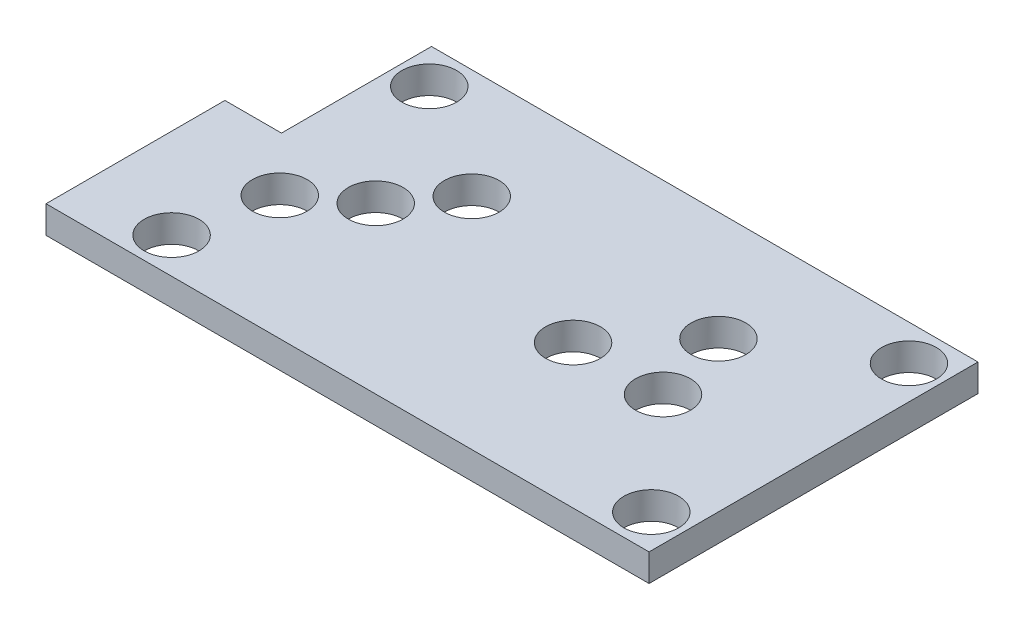
ISO-10303-21;
HEADER;
FILE_DESCRIPTION(('STEP AP214'),'2;1');
FILE_NAME('part.step','',(''),(''),'','','');
FILE_SCHEMA(('AUTOMOTIVE_DESIGN { 1 0 10303 214 1 1 1 1 }'));
ENDSEC;
DATA;
#1=APPLICATION_CONTEXT('core data for automotive mechanical design processes');
#2=APPLICATION_PROTOCOL_DEFINITION('international standard','automotive_design',2000,#1);
#3=PRODUCT_CONTEXT('',#1,'mechanical');
#4=PRODUCT('Part','Part','',(#3));
#5=PRODUCT_RELATED_PRODUCT_CATEGORY('part','',(#4));
#6=PRODUCT_DEFINITION_FORMATION('','',#4);
#7=PRODUCT_DEFINITION_CONTEXT('part definition',#1,'design');
#8=PRODUCT_DEFINITION('design','',#6,#7);
#9=PRODUCT_DEFINITION_SHAPE('','',#8);
#10=(LENGTH_UNIT() NAMED_UNIT(*) SI_UNIT(.MILLI.,.METRE.));
#11=(NAMED_UNIT(*) PLANE_ANGLE_UNIT() SI_UNIT($,.RADIAN.));
#12=(NAMED_UNIT(*) SI_UNIT($,.STERADIAN.) SOLID_ANGLE_UNIT());
#13=UNCERTAINTY_MEASURE_WITH_UNIT(LENGTH_MEASURE(1.E-05),#10,'distance_accuracy_value','');
#14=(GEOMETRIC_REPRESENTATION_CONTEXT(3) GLOBAL_UNCERTAINTY_ASSIGNED_CONTEXT((#13)) GLOBAL_UNIT_ASSIGNED_CONTEXT((#10,
#11,#12)) REPRESENTATION_CONTEXT('',''));
#15=CARTESIAN_POINT('',(0.,0.,0.));
#16=DIRECTION('',(0.,0.,1.));
#17=DIRECTION('',(1.,0.,0.));
#18=AXIS2_PLACEMENT_3D('',#15,#16,#17);
#19=CARTESIAN_POINT('',(110.,-10.,60.));
#20=DIRECTION('',(1.,0.,0.));
#21=DIRECTION('',(0.,0.,-1.));
#22=AXIS2_PLACEMENT_3D('',#19,#20,#21);
#23=PLANE('',#22);
#24=DIRECTION('',(0.,0.,-1.));
#25=VECTOR('',#24,1.);
#26=CARTESIAN_POINT('',(110.,0.,60.));
#27=LINE('',#26,#25);
#28=CARTESIAN_POINT('',(110.,0.,60.));
#29=VERTEX_POINT('',#28);
#30=CARTESIAN_POINT('',(110.,0.,-60.));
#31=VERTEX_POINT('',#30);
#32=EDGE_CURVE('E129',#29,#31,#27,.T.);
#33=ORIENTED_EDGE('',*,*,#32,.F.);
#34=DIRECTION('',(0.,1.,0.));
#35=VECTOR('',#34,1.);
#36=CARTESIAN_POINT('',(110.,-10.,60.));
#37=LINE('',#36,#35);
#38=CARTESIAN_POINT('',(110.,-10.,60.));
#39=VERTEX_POINT('',#38);
#40=EDGE_CURVE('E11',#39,#29,#37,.T.);
#41=ORIENTED_EDGE('',*,*,#40,.F.);
#42=DIRECTION('',(0.,0.,-1.));
#43=VECTOR('',#42,1.);
#44=CARTESIAN_POINT('',(110.,-10.,60.));
#45=LINE('',#44,#43);
#46=CARTESIAN_POINT('',(110.,-10.,-60.));
#47=VERTEX_POINT('',#46);
#48=EDGE_CURVE('E120',#39,#47,#45,.T.);
#49=ORIENTED_EDGE('',*,*,#48,.T.);
#50=DIRECTION('',(0.,1.,0.));
#51=VECTOR('',#50,1.);
#52=CARTESIAN_POINT('',(110.,-10.,-60.));
#53=LINE('',#52,#51);
#54=EDGE_CURVE('E42',#47,#31,#53,.T.);
#55=ORIENTED_EDGE('',*,*,#54,.T.);
#56=EDGE_LOOP('',(#33,#41,#49,#55));
#57=FACE_BOUND('',#56,.T.);
#58=ADVANCED_FACE('F39',(#57),#23,.T.);
#59=CARTESIAN_POINT('',(-110.,-10.,60.));
#60=DIRECTION('',(0.,0.,1.));
#61=DIRECTION('',(1.,0.,0.));
#62=AXIS2_PLACEMENT_3D('',#59,#60,#61);
#63=PLANE('',#62);
#64=DIRECTION('',(1.,0.,0.));
#65=VECTOR('',#64,1.);
#66=CARTESIAN_POINT('',(-110.,0.,60.));
#67=LINE('',#66,#65);
#68=CARTESIAN_POINT('',(-110.,0.,60.));
#69=VERTEX_POINT('',#68);
#70=EDGE_CURVE('E124',#69,#29,#67,.T.);
#71=ORIENTED_EDGE('',*,*,#70,.F.);
#72=DIRECTION('',(0.,1.,0.));
#73=VECTOR('',#72,1.);
#74=CARTESIAN_POINT('',(-110.,-10.,60.));
#75=LINE('',#74,#73);
#76=CARTESIAN_POINT('',(-110.,-10.,60.));
#77=VERTEX_POINT('',#76);
#78=EDGE_CURVE('E47',#77,#69,#75,.T.);
#79=ORIENTED_EDGE('',*,*,#78,.F.);
#80=DIRECTION('',(1.,0.,0.));
#81=VECTOR('',#80,1.);
#82=CARTESIAN_POINT('',(-110.,-10.,60.));
#83=LINE('',#82,#81);
#84=EDGE_CURVE('E122',#77,#39,#83,.T.);
#85=ORIENTED_EDGE('',*,*,#84,.T.);
#86=ORIENTED_EDGE('',*,*,#40,.T.);
#87=EDGE_LOOP('',(#71,#79,#85,#86));
#88=FACE_BOUND('',#87,.T.);
#89=ADVANCED_FACE('F143',(#88),#63,.T.);
#90=CARTESIAN_POINT('',(-110.,-10.,60.));
#91=DIRECTION('',(-1.,0.,0.));
#92=DIRECTION('',(0.,0.,1.));
#93=AXIS2_PLACEMENT_3D('',#90,#91,#92);
#94=PLANE('',#93);
#95=DIRECTION('',(0.,1.,0.));
#96=VECTOR('',#95,1.);
#97=CARTESIAN_POINT('',(-110.,-10.001,-5.2699959967968));
#98=LINE('',#97,#96);
#99=CARTESIAN_POINT('',(-110.,-10.,-5.2699959967968));
#100=VERTEX_POINT('',#99);
#101=CARTESIAN_POINT('',(-110.,0.,-5.2699959967968));
#102=VERTEX_POINT('',#101);
#103=EDGE_CURVE('E55',#100,#102,#98,.T.);
#104=ORIENTED_EDGE('',*,*,#103,.F.);
#105=DIRECTION('',(0.,0.,1.));
#106=VECTOR('',#105,1.);
#107=CARTESIAN_POINT('',(-110.,-10.,60.));
#108=LINE('',#107,#106);
#109=EDGE_CURVE('E119',#100,#77,#108,.T.);
#110=ORIENTED_EDGE('',*,*,#109,.T.);
#111=ORIENTED_EDGE('',*,*,#78,.T.);
#112=DIRECTION('',(0.,0.,1.));
#113=VECTOR('',#112,1.);
#114=CARTESIAN_POINT('',(-110.,0.,60.));
#115=LINE('',#114,#113);
#116=EDGE_CURVE('E134',#102,#69,#115,.T.);
#117=ORIENTED_EDGE('',*,*,#116,.F.);
#118=EDGE_LOOP('',(#104,#110,#111,#117));
#119=FACE_BOUND('',#118,.T.);
#120=ADVANCED_FACE('F145',(#119),#94,.T.);
#121=CARTESIAN_POINT('',(-110.,-10.,-60.));
#122=DIRECTION('',(0.,0.,-1.));
#123=DIRECTION('',(-1.,0.,0.));
#124=AXIS2_PLACEMENT_3D('',#121,#122,#123);
#125=PLANE('',#124);
#126=DIRECTION('',(0.,1.,0.));
#127=VECTOR('',#126,1.);
#128=CARTESIAN_POINT('',(-89.3674969975976,-10.001,-60.));
#129=LINE('',#128,#127);
#130=CARTESIAN_POINT('',(-89.3674969975976,-10.,-60.));
#131=VERTEX_POINT('',#130);
#132=CARTESIAN_POINT('',(-89.3674969975976,0.,-60.));
#133=VERTEX_POINT('',#132);
#134=EDGE_CURVE('E99',#131,#133,#129,.T.);
#135=ORIENTED_EDGE('',*,*,#134,.T.);
#136=DIRECTION('',(-1.,0.,0.));
#137=VECTOR('',#136,1.);
#138=CARTESIAN_POINT('',(-110.,0.,-60.));
#139=LINE('',#138,#137);
#140=EDGE_CURVE('E132',#31,#133,#139,.T.);
#141=ORIENTED_EDGE('',*,*,#140,.F.);
#142=ORIENTED_EDGE('',*,*,#54,.F.);
#143=DIRECTION('',(-1.,0.,0.));
#144=VECTOR('',#143,1.);
#145=CARTESIAN_POINT('',(-110.,-10.,-60.));
#146=LINE('',#145,#144);
#147=EDGE_CURVE('E113',#47,#131,#146,.T.);
#148=ORIENTED_EDGE('',*,*,#147,.T.);
#149=EDGE_LOOP('',(#135,#141,#142,#148));
#150=FACE_BOUND('',#149,.T.);
#151=ADVANCED_FACE('F118',(#150),#125,.T.);
#152=CARTESIAN_POINT('',(0.,-10.,0.));
#153=DIRECTION('',(0.,-1.,0.));
#154=DIRECTION('',(0.,0.,-1.));
#155=AXIS2_PLACEMENT_3D('',#152,#153,#154);
#156=PLANE('',#155);
#157=CARTESIAN_POINT('',(62.8162515012012,-10.,7.72));
#158=DIRECTION('',(0.,-1.,0.));
#159=DIRECTION('',(0.,0.,-1.));
#160=AXIS2_PLACEMENT_3D('',#157,#158,#159);
#161=CIRCLE('',#160,10.);
#162=CARTESIAN_POINT('',(62.8162515012012,-10.,-2.28000000000001));
#163=VERTEX_POINT('',#162);
#164=EDGE_CURVE('E173',#163,#163,#161,.F.);
#165=ORIENTED_EDGE('',*,*,#164,.T.);
#166=EDGE_LOOP('',(#165));
#167=FACE_BOUND('',#166,.T.);
#168=CARTESIAN_POINT('',(55.3162515012012,-10.,-20.));
#169=DIRECTION('',(0.,-1.,0.));
#170=DIRECTION('',(0.,0.,-1.));
#171=AXIS2_PLACEMENT_3D('',#168,#169,#170);
#172=CIRCLE('',#171,10.);
#173=CARTESIAN_POINT('',(55.3162515012012,-10.,-30.));
#174=VERTEX_POINT('',#173);
#175=EDGE_CURVE('E184',#174,#174,#172,.F.);
#176=ORIENTED_EDGE('',*,*,#175,.T.);
#177=EDGE_LOOP('',(#176));
#178=FACE_BOUND('',#177,.T.);
#179=CARTESIAN_POINT('',(97.8162515012012,-10.,-47.));
#180=DIRECTION('',(0.,-1.,0.));
#181=DIRECTION('',(0.,0.,-1.));
#182=AXIS2_PLACEMENT_3D('',#179,#180,#181);
#183=CIRCLE('',#182,10.);
#184=CARTESIAN_POINT('',(97.8162515012012,-10.,-57.));
#185=VERTEX_POINT('',#184);
#186=EDGE_CURVE('E185',#185,#185,#183,.F.);
#187=ORIENTED_EDGE('',*,*,#186,.T.);
#188=EDGE_LOOP('',(#187));
#189=FACE_BOUND('',#188,.T.);
#190=CARTESIAN_POINT('',(-34.6837484987988,-10.,-20.));
#191=DIRECTION('',(0.,-1.,0.));
#192=DIRECTION('',(0.,0.,-1.));
#193=AXIS2_PLACEMENT_3D('',#190,#191,#192);
#194=CIRCLE('',#193,9.99999999999999);
#195=CARTESIAN_POINT('',(-34.6837484987988,-10.,-30.));
#196=VERTEX_POINT('',#195);
#197=EDGE_CURVE('E196',#196,#196,#194,.F.);
#198=ORIENTED_EDGE('',*,*,#197,.T.);
#199=EDGE_LOOP('',(#198));
#200=FACE_BOUND('',#199,.T.);
#201=CARTESIAN_POINT('',(-77.1837484987988,-10.,47.));
#202=DIRECTION('',(0.,-1.,0.));
#203=DIRECTION('',(0.,0.,-1.));
#204=AXIS2_PLACEMENT_3D('',#201,#202,#203);
#205=CIRCLE('',#204,10.);
#206=CARTESIAN_POINT('',(-77.1837484987988,-10.,37.));
#207=VERTEX_POINT('',#206);
#208=EDGE_CURVE('E154',#207,#207,#205,.F.);
#209=ORIENTED_EDGE('',*,*,#208,.T.);
#210=EDGE_LOOP('',(#209));
#211=FACE_BOUND('',#210,.T.);
#212=CARTESIAN_POINT('',(-70.,-10.,14.72));
#213=DIRECTION('',(0.,-1.,0.));
#214=DIRECTION('',(0.,0.,-1.));
#215=AXIS2_PLACEMENT_3D('',#212,#213,#214);
#216=CIRCLE('',#215,10.);
#217=CARTESIAN_POINT('',(-70.,-10.,4.71999999999998));
#218=VERTEX_POINT('',#217);
#219=EDGE_CURVE('E160',#218,#218,#216,.F.);
#220=ORIENTED_EDGE('',*,*,#219,.T.);
#221=EDGE_LOOP('',(#220));
#222=FACE_BOUND('',#221,.T.);
#223=CARTESIAN_POINT('',(-50.,-10.,-0.280000000000006));
#224=DIRECTION('',(0.,-1.,0.));
#225=DIRECTION('',(0.,0.,-1.));
#226=AXIS2_PLACEMENT_3D('',#223,#224,#225);
#227=CIRCLE('',#226,10.);
#228=CARTESIAN_POINT('',(-50.,-10.,-10.28));
#229=VERTEX_POINT('',#228);
#230=EDGE_CURVE('E161',#229,#229,#227,.F.);
#231=ORIENTED_EDGE('',*,*,#230,.T.);
#232=EDGE_LOOP('',(#231));
#233=FACE_BOUND('',#232,.T.);
#234=CARTESIAN_POINT('',(30.,-10.,7.72));
#235=DIRECTION('',(0.,-1.,0.));
#236=DIRECTION('',(0.,0.,-1.));
#237=AXIS2_PLACEMENT_3D('',#234,#235,#236);
#238=CIRCLE('',#237,10.);
#239=CARTESIAN_POINT('',(30.,-10.,-2.28000000000001));
#240=VERTEX_POINT('',#239);
#241=EDGE_CURVE('E172',#240,#240,#238,.F.);
#242=ORIENTED_EDGE('',*,*,#241,.T.);
#243=EDGE_LOOP('',(#242));
#244=FACE_BOUND('',#243,.T.);
#245=CARTESIAN_POINT('',(-77.1837484987988,-10.,-47.));
#246=DIRECTION('',(0.,-1.,0.));
#247=DIRECTION('',(0.,0.,-1.));
#248=AXIS2_PLACEMENT_3D('',#245,#246,#247);
#249=CIRCLE('',#248,10.);
#250=CARTESIAN_POINT('',(-77.1837484987988,-10.,-57.));
#251=VERTEX_POINT('',#250);
#252=EDGE_CURVE('E197',#251,#251,#249,.F.);
#253=ORIENTED_EDGE('',*,*,#252,.T.);
#254=EDGE_LOOP('',(#253));
#255=FACE_BOUND('',#254,.T.);
#256=CARTESIAN_POINT('',(97.8162515012012,-10.,47.));
#257=DIRECTION('',(0.,-1.,0.));
#258=DIRECTION('',(0.,0.,-1.));
#259=AXIS2_PLACEMENT_3D('',#256,#257,#258);
#260=CIRCLE('',#259,10.);
#261=CARTESIAN_POINT('',(97.8162515012012,-10.,37.));
#262=VERTEX_POINT('',#261);
#263=EDGE_CURVE('E151',#262,#262,#260,.F.);
#264=ORIENTED_EDGE('',*,*,#263,.T.);
#265=EDGE_LOOP('',(#264));
#266=FACE_BOUND('',#265,.T.);
#267=DIRECTION('',(0.,0.,-1.));
#268=VECTOR('',#267,1.);
#269=CARTESIAN_POINT('',(-89.3674969975976,-10.,-60.));
#270=LINE('',#269,#268);
#271=CARTESIAN_POINT('',(-89.3674969975976,-10.,-5.2699959967968));
#272=VERTEX_POINT('',#271);
#273=EDGE_CURVE('E102',#272,#131,#270,.T.);
#274=ORIENTED_EDGE('',*,*,#273,.T.);
#275=ORIENTED_EDGE('',*,*,#147,.F.);
#276=ORIENTED_EDGE('',*,*,#48,.F.);
#277=ORIENTED_EDGE('',*,*,#84,.F.);
#278=ORIENTED_EDGE('',*,*,#109,.F.);
#279=DIRECTION('',(1.,0.,0.));
#280=VECTOR('',#279,1.);
#281=CARTESIAN_POINT('',(-110.,-10.,-5.2699959967968));
#282=LINE('',#281,#280);
#283=EDGE_CURVE('E107',#100,#272,#282,.T.);
#284=ORIENTED_EDGE('',*,*,#283,.T.);
#285=EDGE_LOOP('',(#274,#275,#276,#277,#278,#284));
#286=FACE_BOUND('',#285,.T.);
#287=ADVANCED_FACE('F112',(#167,#178,#189,#200,#211,#222,#233,#244,#255,#266,#286),#156,.T.);
#288=CARTESIAN_POINT('',(0.,0.,0.));
#289=DIRECTION('',(0.,-1.,0.));
#290=DIRECTION('',(0.,0.,-1.));
#291=AXIS2_PLACEMENT_3D('',#288,#289,#290);
#292=PLANE('',#291);
#293=CARTESIAN_POINT('',(62.8162515012012,0.,7.72));
#294=DIRECTION('',(0.,1.,0.));
#295=DIRECTION('',(0.,0.,1.));
#296=AXIS2_PLACEMENT_3D('',#293,#294,#295);
#297=CIRCLE('',#296,10.);
#298=CARTESIAN_POINT('',(62.8162515012012,0.,17.72));
#299=VERTEX_POINT('',#298);
#300=EDGE_CURVE('E188',#299,#299,#297,.T.);
#301=ORIENTED_EDGE('',*,*,#300,.F.);
#302=EDGE_LOOP('',(#301));
#303=FACE_BOUND('',#302,.T.);
#304=CARTESIAN_POINT('',(55.3162515012012,0.,-20.));
#305=DIRECTION('',(0.,1.,0.));
#306=DIRECTION('',(0.,0.,1.));
#307=AXIS2_PLACEMENT_3D('',#304,#305,#306);
#308=CIRCLE('',#307,10.);
#309=CARTESIAN_POINT('',(55.3162515012012,0.,-9.99999999999999));
#310=VERTEX_POINT('',#309);
#311=EDGE_CURVE('E181',#310,#310,#308,.T.);
#312=ORIENTED_EDGE('',*,*,#311,.F.);
#313=EDGE_LOOP('',(#312));
#314=FACE_BOUND('',#313,.T.);
#315=CARTESIAN_POINT('',(97.8162515012012,0.,-47.));
#316=DIRECTION('',(0.,1.,0.));
#317=DIRECTION('',(0.,0.,1.));
#318=AXIS2_PLACEMENT_3D('',#315,#316,#317);
#319=CIRCLE('',#318,10.);
#320=CARTESIAN_POINT('',(97.8162515012012,0.,-37.));
#321=VERTEX_POINT('',#320);
#322=EDGE_CURVE('E200',#321,#321,#319,.T.);
#323=ORIENTED_EDGE('',*,*,#322,.F.);
#324=EDGE_LOOP('',(#323));
#325=FACE_BOUND('',#324,.T.);
#326=CARTESIAN_POINT('',(-34.6837484987988,0.,-20.));
#327=DIRECTION('',(0.,1.,0.));
#328=DIRECTION('',(0.,0.,1.));
#329=AXIS2_PLACEMENT_3D('',#326,#327,#328);
#330=CIRCLE('',#329,9.99999999999999);
#331=CARTESIAN_POINT('',(-34.6837484987988,0.,-9.99999999999999));
#332=VERTEX_POINT('',#331);
#333=EDGE_CURVE('E193',#332,#332,#330,.T.);
#334=ORIENTED_EDGE('',*,*,#333,.F.);
#335=EDGE_LOOP('',(#334));
#336=FACE_BOUND('',#335,.T.);
#337=CARTESIAN_POINT('',(-77.1837484987988,0.,47.));
#338=DIRECTION('',(0.,1.,0.));
#339=DIRECTION('',(0.,0.,1.));
#340=AXIS2_PLACEMENT_3D('',#337,#338,#339);
#341=CIRCLE('',#340,10.);
#342=CARTESIAN_POINT('',(-77.1837484987988,0.,57.));
#343=VERTEX_POINT('',#342);
#344=EDGE_CURVE('E164',#343,#343,#341,.T.);
#345=ORIENTED_EDGE('',*,*,#344,.F.);
#346=EDGE_LOOP('',(#345));
#347=FACE_BOUND('',#346,.T.);
#348=CARTESIAN_POINT('',(-70.,0.,14.72));
#349=DIRECTION('',(0.,1.,0.));
#350=DIRECTION('',(0.,0.,1.));
#351=AXIS2_PLACEMENT_3D('',#348,#349,#350);
#352=CIRCLE('',#351,10.);
#353=CARTESIAN_POINT('',(-70.,0.,24.72));
#354=VERTEX_POINT('',#353);
#355=EDGE_CURVE('E157',#354,#354,#352,.T.);
#356=ORIENTED_EDGE('',*,*,#355,.F.);
#357=EDGE_LOOP('',(#356));
#358=FACE_BOUND('',#357,.T.);
#359=CARTESIAN_POINT('',(-50.,0.,-0.280000000000006));
#360=DIRECTION('',(0.,1.,0.));
#361=DIRECTION('',(0.,0.,1.));
#362=AXIS2_PLACEMENT_3D('',#359,#360,#361);
#363=CIRCLE('',#362,10.);
#364=CARTESIAN_POINT('',(-50.,0.,9.72));
#365=VERTEX_POINT('',#364);
#366=EDGE_CURVE('E176',#365,#365,#363,.T.);
#367=ORIENTED_EDGE('',*,*,#366,.F.);
#368=EDGE_LOOP('',(#367));
#369=FACE_BOUND('',#368,.T.);
#370=CARTESIAN_POINT('',(30.,0.,7.72));
#371=DIRECTION('',(0.,1.,0.));
#372=DIRECTION('',(0.,0.,1.));
#373=AXIS2_PLACEMENT_3D('',#370,#371,#372);
#374=CIRCLE('',#373,10.);
#375=CARTESIAN_POINT('',(30.,0.,17.72));
#376=VERTEX_POINT('',#375);
#377=EDGE_CURVE('E169',#376,#376,#374,.T.);
#378=ORIENTED_EDGE('',*,*,#377,.F.);
#379=EDGE_LOOP('',(#378));
#380=FACE_BOUND('',#379,.T.);
#381=CARTESIAN_POINT('',(-77.1837484987988,0.,-47.));
#382=DIRECTION('',(0.,1.,0.));
#383=DIRECTION('',(0.,0.,1.));
#384=AXIS2_PLACEMENT_3D('',#381,#382,#383);
#385=CIRCLE('',#384,10.);
#386=CARTESIAN_POINT('',(-77.1837484987988,0.,-37.));
#387=VERTEX_POINT('',#386);
#388=EDGE_CURVE('E205',#387,#387,#385,.T.);
#389=ORIENTED_EDGE('',*,*,#388,.F.);
#390=EDGE_LOOP('',(#389));
#391=FACE_BOUND('',#390,.T.);
#392=CARTESIAN_POINT('',(97.8162515012012,0.,47.));
#393=DIRECTION('',(0.,1.,0.));
#394=DIRECTION('',(0.,0.,1.));
#395=AXIS2_PLACEMENT_3D('',#392,#393,#394);
#396=CIRCLE('',#395,10.);
#397=CARTESIAN_POINT('',(97.8162515012012,0.,57.));
#398=VERTEX_POINT('',#397);
#399=EDGE_CURVE('E116',#398,#398,#396,.T.);
#400=ORIENTED_EDGE('',*,*,#399,.F.);
#401=EDGE_LOOP('',(#400));
#402=FACE_BOUND('',#401,.T.);
#403=ORIENTED_EDGE('',*,*,#140,.T.);
#404=DIRECTION('',(0.,0.,-1.));
#405=VECTOR('',#404,1.);
#406=CARTESIAN_POINT('',(-89.3674969975976,0.,-60.));
#407=LINE('',#406,#405);
#408=CARTESIAN_POINT('',(-89.3674969975976,0.,-5.2699959967968));
#409=VERTEX_POINT('',#408);
#410=EDGE_CURVE('E105',#409,#133,#407,.T.);
#411=ORIENTED_EDGE('',*,*,#410,.F.);
#412=DIRECTION('',(1.,0.,0.));
#413=VECTOR('',#412,1.);
#414=CARTESIAN_POINT('',(-110.,0.,-5.2699959967968));
#415=LINE('',#414,#413);
#416=EDGE_CURVE('E115',#102,#409,#415,.T.);
#417=ORIENTED_EDGE('',*,*,#416,.F.);
#418=ORIENTED_EDGE('',*,*,#116,.T.);
#419=ORIENTED_EDGE('',*,*,#70,.T.);
#420=ORIENTED_EDGE('',*,*,#32,.T.);
#421=EDGE_LOOP('',(#403,#411,#417,#418,#419,#420));
#422=FACE_BOUND('',#421,.T.);
#423=ADVANCED_FACE('F142',(#303,#314,#325,#336,#347,#358,#369,#380,#391,#402,#422),#292,.F.);
#424=CARTESIAN_POINT('',(-89.3674969975976,-10.001,-60.));
#425=DIRECTION('',(1.,0.,0.));
#426=DIRECTION('',(0.,0.,-1.));
#427=AXIS2_PLACEMENT_3D('',#424,#425,#426);
#428=PLANE('',#427);
#429=DIRECTION('',(0.,1.,0.));
#430=VECTOR('',#429,1.);
#431=CARTESIAN_POINT('',(-89.3674969975976,-10.001,-5.2699959967968));
#432=LINE('',#431,#430);
#433=EDGE_CURVE('E108',#272,#409,#432,.T.);
#434=ORIENTED_EDGE('',*,*,#433,.T.);
#435=ORIENTED_EDGE('',*,*,#410,.T.);
#436=ORIENTED_EDGE('',*,*,#134,.F.);
#437=ORIENTED_EDGE('',*,*,#273,.F.);
#438=EDGE_LOOP('',(#434,#435,#436,#437));
#439=FACE_BOUND('',#438,.T.);
#440=ADVANCED_FACE('F101',(#439),#428,.F.);
#441=CARTESIAN_POINT('',(-110.,-10.001,-5.2699959967968));
#442=DIRECTION('',(0.,0.,1.));
#443=DIRECTION('',(1.,0.,0.));
#444=AXIS2_PLACEMENT_3D('',#441,#442,#443);
#445=PLANE('',#444);
#446=ORIENTED_EDGE('',*,*,#103,.T.);
#447=ORIENTED_EDGE('',*,*,#416,.T.);
#448=ORIENTED_EDGE('',*,*,#433,.F.);
#449=ORIENTED_EDGE('',*,*,#283,.F.);
#450=EDGE_LOOP('',(#446,#447,#448,#449));
#451=FACE_BOUND('',#450,.T.);
#452=ADVANCED_FACE('F228',(#451),#445,.F.);
#453=CARTESIAN_POINT('',(97.8162515012012,-10.001,47.));
#454=DIRECTION('',(0.,1.,0.));
#455=DIRECTION('',(0.,0.,1.));
#456=AXIS2_PLACEMENT_3D('',#453,#454,#455);
#457=CYLINDRICAL_SURFACE('',#456,10.);
#458=ORIENTED_EDGE('',*,*,#263,.F.);
#459=EDGE_LOOP('',(#458));
#460=FACE_BOUND('',#459,.T.);
#461=ORIENTED_EDGE('',*,*,#399,.T.);
#462=EDGE_LOOP('',(#461));
#463=FACE_BOUND('',#462,.T.);
#464=ADVANCED_FACE('F217',(#460,#463),#457,.F.);
#465=CARTESIAN_POINT('',(-77.1837484987988,-10.001,-47.));
#466=DIRECTION('',(0.,1.,0.));
#467=DIRECTION('',(0.,0.,1.));
#468=AXIS2_PLACEMENT_3D('',#465,#466,#467);
#469=CYLINDRICAL_SURFACE('',#468,10.);
#470=ORIENTED_EDGE('',*,*,#252,.F.);
#471=EDGE_LOOP('',(#470));
#472=FACE_BOUND('',#471,.T.);
#473=ORIENTED_EDGE('',*,*,#388,.T.);
#474=EDGE_LOOP('',(#473));
#475=FACE_BOUND('',#474,.T.);
#476=ADVANCED_FACE('F213',(#472,#475),#469,.F.);
#477=CARTESIAN_POINT('',(30.,-10.001,7.72));
#478=DIRECTION('',(0.,1.,0.));
#479=DIRECTION('',(0.,0.,1.));
#480=AXIS2_PLACEMENT_3D('',#477,#478,#479);
#481=CYLINDRICAL_SURFACE('',#480,10.);
#482=ORIENTED_EDGE('',*,*,#241,.F.);
#483=EDGE_LOOP('',(#482));
#484=FACE_BOUND('',#483,.T.);
#485=ORIENTED_EDGE('',*,*,#377,.T.);
#486=EDGE_LOOP('',(#485));
#487=FACE_BOUND('',#486,.T.);
#488=ADVANCED_FACE('F216',(#484,#487),#481,.F.);
#489=CARTESIAN_POINT('',(-50.,-10.001,-0.280000000000006));
#490=DIRECTION('',(0.,1.,0.));
#491=DIRECTION('',(0.,0.,1.));
#492=AXIS2_PLACEMENT_3D('',#489,#490,#491);
#493=CYLINDRICAL_SURFACE('',#492,10.);
#494=ORIENTED_EDGE('',*,*,#230,.F.);
#495=EDGE_LOOP('',(#494));
#496=FACE_BOUND('',#495,.T.);
#497=ORIENTED_EDGE('',*,*,#366,.T.);
#498=EDGE_LOOP('',(#497));
#499=FACE_BOUND('',#498,.T.);
#500=ADVANCED_FACE('F285',(#496,#499),#493,.F.);
#501=CARTESIAN_POINT('',(-70.,-10.001,14.72));
#502=DIRECTION('',(0.,1.,0.));
#503=DIRECTION('',(0.,0.,1.));
#504=AXIS2_PLACEMENT_3D('',#501,#502,#503);
#505=CYLINDRICAL_SURFACE('',#504,10.);
#506=ORIENTED_EDGE('',*,*,#219,.F.);
#507=EDGE_LOOP('',(#506));
#508=FACE_BOUND('',#507,.T.);
#509=ORIENTED_EDGE('',*,*,#355,.T.);
#510=EDGE_LOOP('',(#509));
#511=FACE_BOUND('',#510,.T.);
#512=ADVANCED_FACE('F295',(#508,#511),#505,.F.);
#513=CARTESIAN_POINT('',(-77.1837484987988,-10.001,47.));
#514=DIRECTION('',(0.,1.,0.));
#515=DIRECTION('',(0.,0.,1.));
#516=AXIS2_PLACEMENT_3D('',#513,#514,#515);
#517=CYLINDRICAL_SURFACE('',#516,10.);
#518=ORIENTED_EDGE('',*,*,#208,.F.);
#519=EDGE_LOOP('',(#518));
#520=FACE_BOUND('',#519,.T.);
#521=ORIENTED_EDGE('',*,*,#344,.T.);
#522=EDGE_LOOP('',(#521));
#523=FACE_BOUND('',#522,.T.);
#524=ADVANCED_FACE('F305',(#520,#523),#517,.F.);
#525=CARTESIAN_POINT('',(-34.6837484987988,-10.001,-20.));
#526=DIRECTION('',(0.,1.,0.));
#527=DIRECTION('',(0.,0.,1.));
#528=AXIS2_PLACEMENT_3D('',#525,#526,#527);
#529=CYLINDRICAL_SURFACE('',#528,9.99999999999999);
#530=ORIENTED_EDGE('',*,*,#197,.F.);
#531=EDGE_LOOP('',(#530));
#532=FACE_BOUND('',#531,.T.);
#533=ORIENTED_EDGE('',*,*,#333,.T.);
#534=EDGE_LOOP('',(#533));
#535=FACE_BOUND('',#534,.T.);
#536=ADVANCED_FACE('F314',(#532,#535),#529,.F.);
#537=CARTESIAN_POINT('',(97.8162515012012,-10.001,-47.));
#538=DIRECTION('',(0.,1.,0.));
#539=DIRECTION('',(0.,0.,1.));
#540=AXIS2_PLACEMENT_3D('',#537,#538,#539);
#541=CYLINDRICAL_SURFACE('',#540,10.);
#542=ORIENTED_EDGE('',*,*,#186,.F.);
#543=EDGE_LOOP('',(#542));
#544=FACE_BOUND('',#543,.T.);
#545=ORIENTED_EDGE('',*,*,#322,.T.);
#546=EDGE_LOOP('',(#545));
#547=FACE_BOUND('',#546,.T.);
#548=ADVANCED_FACE('F324',(#544,#547),#541,.F.);
#549=CARTESIAN_POINT('',(55.3162515012012,-10.001,-20.));
#550=DIRECTION('',(0.,1.,0.));
#551=DIRECTION('',(0.,0.,1.));
#552=AXIS2_PLACEMENT_3D('',#549,#550,#551);
#553=CYLINDRICAL_SURFACE('',#552,10.);
#554=ORIENTED_EDGE('',*,*,#175,.F.);
#555=EDGE_LOOP('',(#554));
#556=FACE_BOUND('',#555,.T.);
#557=ORIENTED_EDGE('',*,*,#311,.T.);
#558=EDGE_LOOP('',(#557));
#559=FACE_BOUND('',#558,.T.);
#560=ADVANCED_FACE('F334',(#556,#559),#553,.F.);
#561=CARTESIAN_POINT('',(62.8162515012012,-10.001,7.72));
#562=DIRECTION('',(0.,1.,0.));
#563=DIRECTION('',(0.,0.,1.));
#564=AXIS2_PLACEMENT_3D('',#561,#562,#563);
#565=CYLINDRICAL_SURFACE('',#564,10.);
#566=ORIENTED_EDGE('',*,*,#164,.F.);
#567=EDGE_LOOP('',(#566));
#568=FACE_BOUND('',#567,.T.);
#569=ORIENTED_EDGE('',*,*,#300,.T.);
#570=EDGE_LOOP('',(#569));
#571=FACE_BOUND('',#570,.T.);
#572=ADVANCED_FACE('F344',(#568,#571),#565,.F.);
#573=CLOSED_SHELL('',(#58,#89,#120,#151,#287,#423,#440,#452,#464,#476,#488,#500,#512,#524,#536,
#548,#560,#572));
#574=MANIFOLD_SOLID_BREP('B2',#573);
#575=ADVANCED_BREP_SHAPE_REPRESENTATION('',(#18,#574),#14);
#576=SHAPE_DEFINITION_REPRESENTATION(#9,#575);
ENDSEC;
END-ISO-10303-21;
